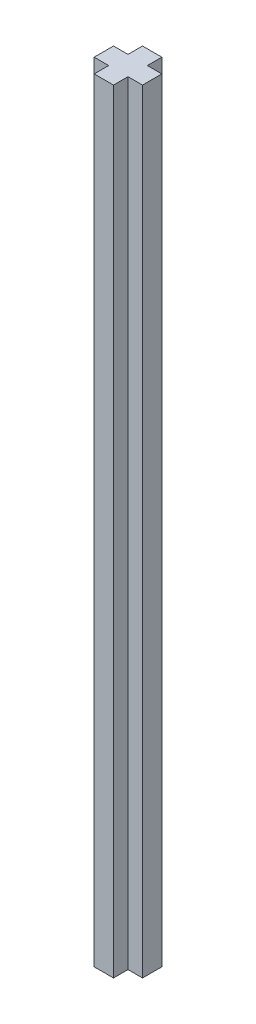
ISO-10303-21;
HEADER;
FILE_DESCRIPTION(('STEP AP214'),'2;1');
FILE_NAME('part.step','',(''),(''),'','','');
FILE_SCHEMA(('AUTOMOTIVE_DESIGN { 1 0 10303 214 1 1 1 1 }'));
ENDSEC;
DATA;
#1=APPLICATION_CONTEXT('core data for automotive mechanical design processes');
#2=APPLICATION_PROTOCOL_DEFINITION('international standard','automotive_design',2000,#1);
#3=PRODUCT_CONTEXT('',#1,'mechanical');
#4=PRODUCT('Part','Part','',(#3));
#5=PRODUCT_RELATED_PRODUCT_CATEGORY('part','',(#4));
#6=PRODUCT_DEFINITION_FORMATION('','',#4);
#7=PRODUCT_DEFINITION_CONTEXT('part definition',#1,'design');
#8=PRODUCT_DEFINITION('design','',#6,#7);
#9=PRODUCT_DEFINITION_SHAPE('','',#8);
#10=(LENGTH_UNIT() NAMED_UNIT(*) SI_UNIT(.MILLI.,.METRE.));
#11=(NAMED_UNIT(*) PLANE_ANGLE_UNIT() SI_UNIT($,.RADIAN.));
#12=(NAMED_UNIT(*) SI_UNIT($,.STERADIAN.) SOLID_ANGLE_UNIT());
#13=UNCERTAINTY_MEASURE_WITH_UNIT(LENGTH_MEASURE(1.E-05),#10,'distance_accuracy_value','');
#14=(GEOMETRIC_REPRESENTATION_CONTEXT(3) GLOBAL_UNCERTAINTY_ASSIGNED_CONTEXT((#13)) GLOBAL_UNIT_ASSIGNED_CONTEXT((#10,
#11,#12)) REPRESENTATION_CONTEXT('',''));
#15=CARTESIAN_POINT('',(0.,0.,0.));
#16=DIRECTION('',(0.,0.,1.));
#17=DIRECTION('',(1.,0.,0.));
#18=AXIS2_PLACEMENT_3D('',#15,#16,#17);
#19=CARTESIAN_POINT('',(1.,80.,0.999999999999999));
#20=DIRECTION('',(-1.,0.,0.));
#21=DIRECTION('',(0.,0.,1.));
#22=AXIS2_PLACEMENT_3D('',#19,#20,#21);
#23=PLANE('',#22);
#24=DIRECTION('',(0.,0.,-1.));
#25=VECTOR('',#24,1.);
#26=CARTESIAN_POINT('',(1.,0.,0.999999999999999));
#27=LINE('',#26,#25);
#28=CARTESIAN_POINT('',(1.,0.,2.5));
#29=VERTEX_POINT('',#28);
#30=CARTESIAN_POINT('',(1.,0.,0.999999999999999));
#31=VERTEX_POINT('',#30);
#32=EDGE_CURVE('E163',#29,#31,#27,.T.);
#33=ORIENTED_EDGE('',*,*,#32,.T.);
#34=DIRECTION('',(0.,-1.,0.));
#35=VECTOR('',#34,1.);
#36=CARTESIAN_POINT('',(1.,80.,0.999999999999999));
#37=LINE('',#36,#35);
#38=CARTESIAN_POINT('',(1.,80.,0.999999999999999));
#39=VERTEX_POINT('',#38);
#40=EDGE_CURVE('E11',#39,#31,#37,.T.);
#41=ORIENTED_EDGE('',*,*,#40,.F.);
#42=DIRECTION('',(0.,0.,-1.));
#43=VECTOR('',#42,1.);
#44=CARTESIAN_POINT('',(1.,80.,0.999999999999999));
#45=LINE('',#44,#43);
#46=CARTESIAN_POINT('',(1.,80.,2.5));
#47=VERTEX_POINT('',#46);
#48=EDGE_CURVE('E197',#47,#39,#45,.T.);
#49=ORIENTED_EDGE('',*,*,#48,.F.);
#50=DIRECTION('',(0.,-1.,0.));
#51=VECTOR('',#50,1.);
#52=CARTESIAN_POINT('',(1.,80.,2.5));
#53=LINE('',#52,#51);
#54=EDGE_CURVE('E159',#47,#29,#53,.T.);
#55=ORIENTED_EDGE('',*,*,#54,.T.);
#56=EDGE_LOOP('',(#33,#41,#49,#55));
#57=FACE_BOUND('',#56,.T.);
#58=ADVANCED_FACE('F38',(#57),#23,.F.);
#59=CARTESIAN_POINT('',(1.,80.,0.999999999999999));
#60=DIRECTION('',(0.,0.,-1.));
#61=DIRECTION('',(-1.,0.,0.));
#62=AXIS2_PLACEMENT_3D('',#59,#60,#61);
#63=PLANE('',#62);
#64=DIRECTION('',(1.,0.,0.));
#65=VECTOR('',#64,1.);
#66=CARTESIAN_POINT('',(1.,0.,0.999999999999999));
#67=LINE('',#66,#65);
#68=CARTESIAN_POINT('',(2.5,0.,0.999999999999999));
#69=VERTEX_POINT('',#68);
#70=EDGE_CURVE('E167',#31,#69,#67,.T.);
#71=ORIENTED_EDGE('',*,*,#70,.T.);
#72=DIRECTION('',(0.,-1.,0.));
#73=VECTOR('',#72,1.);
#74=CARTESIAN_POINT('',(2.5,80.,0.999999999999999));
#75=LINE('',#74,#73);
#76=CARTESIAN_POINT('',(2.5,80.,0.999999999999999));
#77=VERTEX_POINT('',#76);
#78=EDGE_CURVE('E47',#77,#69,#75,.T.);
#79=ORIENTED_EDGE('',*,*,#78,.F.);
#80=DIRECTION('',(1.,0.,0.));
#81=VECTOR('',#80,1.);
#82=CARTESIAN_POINT('',(1.,80.,0.999999999999999));
#83=LINE('',#82,#81);
#84=EDGE_CURVE('E110',#39,#77,#83,.T.);
#85=ORIENTED_EDGE('',*,*,#84,.F.);
#86=ORIENTED_EDGE('',*,*,#40,.T.);
#87=EDGE_LOOP('',(#71,#79,#85,#86));
#88=FACE_BOUND('',#87,.T.);
#89=ADVANCED_FACE('F291',(#88),#63,.F.);
#90=CARTESIAN_POINT('',(2.5,80.,-1.));
#91=DIRECTION('',(-1.,0.,0.));
#92=DIRECTION('',(0.,0.,1.));
#93=AXIS2_PLACEMENT_3D('',#90,#91,#92);
#94=PLANE('',#93);
#95=DIRECTION('',(0.,0.,-1.));
#96=VECTOR('',#95,1.);
#97=CARTESIAN_POINT('',(2.5,0.,-1.));
#98=LINE('',#97,#96);
#99=CARTESIAN_POINT('',(2.5,0.,-1.));
#100=VERTEX_POINT('',#99);
#101=EDGE_CURVE('E170',#69,#100,#98,.T.);
#102=ORIENTED_EDGE('',*,*,#101,.T.);
#103=DIRECTION('',(0.,-1.,0.));
#104=VECTOR('',#103,1.);
#105=CARTESIAN_POINT('',(2.5,80.,-1.));
#106=LINE('',#105,#104);
#107=CARTESIAN_POINT('',(2.5,80.,-1.));
#108=VERTEX_POINT('',#107);
#109=EDGE_CURVE('E224',#108,#100,#106,.T.);
#110=ORIENTED_EDGE('',*,*,#109,.F.);
#111=DIRECTION('',(0.,0.,-1.));
#112=VECTOR('',#111,1.);
#113=CARTESIAN_POINT('',(2.5,80.,-1.));
#114=LINE('',#113,#112);
#115=EDGE_CURVE('E234',#77,#108,#114,.T.);
#116=ORIENTED_EDGE('',*,*,#115,.F.);
#117=ORIENTED_EDGE('',*,*,#78,.T.);
#118=EDGE_LOOP('',(#102,#110,#116,#117));
#119=FACE_BOUND('',#118,.T.);
#120=ADVANCED_FACE('F232',(#119),#94,.F.);
#121=CARTESIAN_POINT('',(1.,80.,-1.));
#122=DIRECTION('',(0.,0.,1.));
#123=DIRECTION('',(1.,0.,0.));
#124=AXIS2_PLACEMENT_3D('',#121,#122,#123);
#125=PLANE('',#124);
#126=DIRECTION('',(-1.,0.,0.));
#127=VECTOR('',#126,1.);
#128=CARTESIAN_POINT('',(1.,0.,-1.));
#129=LINE('',#128,#127);
#130=CARTESIAN_POINT('',(1.,0.,-1.));
#131=VERTEX_POINT('',#130);
#132=EDGE_CURVE('E173',#100,#131,#129,.T.);
#133=ORIENTED_EDGE('',*,*,#132,.T.);
#134=DIRECTION('',(0.,-1.,0.));
#135=VECTOR('',#134,1.);
#136=CARTESIAN_POINT('',(1.,80.,-1.));
#137=LINE('',#136,#135);
#138=CARTESIAN_POINT('',(1.,80.,-1.));
#139=VERTEX_POINT('',#138);
#140=EDGE_CURVE('E220',#139,#131,#137,.T.);
#141=ORIENTED_EDGE('',*,*,#140,.F.);
#142=DIRECTION('',(-1.,0.,0.));
#143=VECTOR('',#142,1.);
#144=CARTESIAN_POINT('',(1.,80.,-1.));
#145=LINE('',#144,#143);
#146=EDGE_CURVE('E253',#108,#139,#145,.T.);
#147=ORIENTED_EDGE('',*,*,#146,.F.);
#148=ORIENTED_EDGE('',*,*,#109,.T.);
#149=EDGE_LOOP('',(#133,#141,#147,#148));
#150=FACE_BOUND('',#149,.T.);
#151=ADVANCED_FACE('F243',(#150),#125,.F.);
#152=CARTESIAN_POINT('',(1.,80.,-2.5));
#153=DIRECTION('',(-1.,0.,0.));
#154=DIRECTION('',(0.,0.,1.));
#155=AXIS2_PLACEMENT_3D('',#152,#153,#154);
#156=PLANE('',#155);
#157=DIRECTION('',(0.,0.,-1.));
#158=VECTOR('',#157,1.);
#159=CARTESIAN_POINT('',(1.,0.,-2.5));
#160=LINE('',#159,#158);
#161=CARTESIAN_POINT('',(1.,0.,-2.5));
#162=VERTEX_POINT('',#161);
#163=EDGE_CURVE('E176',#131,#162,#160,.T.);
#164=ORIENTED_EDGE('',*,*,#163,.T.);
#165=DIRECTION('',(0.,-1.,0.));
#166=VECTOR('',#165,1.);
#167=CARTESIAN_POINT('',(1.,80.,-2.5));
#168=LINE('',#167,#166);
#169=CARTESIAN_POINT('',(1.,80.,-2.5));
#170=VERTEX_POINT('',#169);
#171=EDGE_CURVE('E216',#170,#162,#168,.T.);
#172=ORIENTED_EDGE('',*,*,#171,.F.);
#173=DIRECTION('',(0.,0.,-1.));
#174=VECTOR('',#173,1.);
#175=CARTESIAN_POINT('',(1.,80.,-2.5));
#176=LINE('',#175,#174);
#177=EDGE_CURVE('E249',#139,#170,#176,.T.);
#178=ORIENTED_EDGE('',*,*,#177,.F.);
#179=ORIENTED_EDGE('',*,*,#140,.T.);
#180=EDGE_LOOP('',(#164,#172,#178,#179));
#181=FACE_BOUND('',#180,.T.);
#182=ADVANCED_FACE('F247',(#181),#156,.F.);
#183=CARTESIAN_POINT('',(-1.,80.,-2.5));
#184=DIRECTION('',(0.,0.,1.));
#185=DIRECTION('',(1.,0.,0.));
#186=AXIS2_PLACEMENT_3D('',#183,#184,#185);
#187=PLANE('',#186);
#188=DIRECTION('',(-1.,0.,0.));
#189=VECTOR('',#188,1.);
#190=CARTESIAN_POINT('',(-1.,0.,-2.5));
#191=LINE('',#190,#189);
#192=CARTESIAN_POINT('',(-1.,0.,-2.5));
#193=VERTEX_POINT('',#192);
#194=EDGE_CURVE('E179',#162,#193,#191,.T.);
#195=ORIENTED_EDGE('',*,*,#194,.T.);
#196=DIRECTION('',(0.,-1.,0.));
#197=VECTOR('',#196,1.);
#198=CARTESIAN_POINT('',(-1.,80.,-2.5));
#199=LINE('',#198,#197);
#200=CARTESIAN_POINT('',(-1.,80.,-2.5));
#201=VERTEX_POINT('',#200);
#202=EDGE_CURVE('E212',#201,#193,#199,.T.);
#203=ORIENTED_EDGE('',*,*,#202,.F.);
#204=DIRECTION('',(-1.,0.,0.));
#205=VECTOR('',#204,1.);
#206=CARTESIAN_POINT('',(-1.,80.,-2.5));
#207=LINE('',#206,#205);
#208=EDGE_CURVE('E252',#170,#201,#207,.T.);
#209=ORIENTED_EDGE('',*,*,#208,.F.);
#210=ORIENTED_EDGE('',*,*,#171,.T.);
#211=EDGE_LOOP('',(#195,#203,#209,#210));
#212=FACE_BOUND('',#211,.T.);
#213=ADVANCED_FACE('F304',(#212),#187,.F.);
#214=CARTESIAN_POINT('',(-1.,80.,-2.5));
#215=DIRECTION('',(1.,0.,0.));
#216=DIRECTION('',(0.,0.,-1.));
#217=AXIS2_PLACEMENT_3D('',#214,#215,#216);
#218=PLANE('',#217);
#219=DIRECTION('',(0.,0.,1.));
#220=VECTOR('',#219,1.);
#221=CARTESIAN_POINT('',(-1.,0.,-2.5));
#222=LINE('',#221,#220);
#223=CARTESIAN_POINT('',(-1.,0.,-1.));
#224=VERTEX_POINT('',#223);
#225=EDGE_CURVE('E182',#193,#224,#222,.T.);
#226=ORIENTED_EDGE('',*,*,#225,.T.);
#227=DIRECTION('',(0.,-1.,0.));
#228=VECTOR('',#227,1.);
#229=CARTESIAN_POINT('',(-1.,80.,-1.));
#230=LINE('',#229,#228);
#231=CARTESIAN_POINT('',(-1.,80.,-1.));
#232=VERTEX_POINT('',#231);
#233=EDGE_CURVE('E208',#232,#224,#230,.T.);
#234=ORIENTED_EDGE('',*,*,#233,.F.);
#235=DIRECTION('',(0.,0.,1.));
#236=VECTOR('',#235,1.);
#237=CARTESIAN_POINT('',(-1.,80.,-2.5));
#238=LINE('',#237,#236);
#239=EDGE_CURVE('E257',#201,#232,#238,.T.);
#240=ORIENTED_EDGE('',*,*,#239,.F.);
#241=ORIENTED_EDGE('',*,*,#202,.T.);
#242=EDGE_LOOP('',(#226,#234,#240,#241));
#243=FACE_BOUND('',#242,.T.);
#244=ADVANCED_FACE('F307',(#243),#218,.F.);
#245=CARTESIAN_POINT('',(-2.5,80.,-1.));
#246=DIRECTION('',(0.,0.,1.));
#247=DIRECTION('',(1.,0.,0.));
#248=AXIS2_PLACEMENT_3D('',#245,#246,#247);
#249=PLANE('',#248);
#250=DIRECTION('',(-1.,0.,0.));
#251=VECTOR('',#250,1.);
#252=CARTESIAN_POINT('',(-2.5,0.,-1.));
#253=LINE('',#252,#251);
#254=CARTESIAN_POINT('',(-2.5,0.,-1.));
#255=VERTEX_POINT('',#254);
#256=EDGE_CURVE('E185',#224,#255,#253,.T.);
#257=ORIENTED_EDGE('',*,*,#256,.T.);
#258=DIRECTION('',(0.,-1.,0.));
#259=VECTOR('',#258,1.);
#260=CARTESIAN_POINT('',(-2.5,80.,-1.));
#261=LINE('',#260,#259);
#262=CARTESIAN_POINT('',(-2.5,80.,-1.));
#263=VERTEX_POINT('',#262);
#264=EDGE_CURVE('E204',#263,#255,#261,.T.);
#265=ORIENTED_EDGE('',*,*,#264,.F.);
#266=DIRECTION('',(-1.,0.,0.));
#267=VECTOR('',#266,1.);
#268=CARTESIAN_POINT('',(-2.5,80.,-1.));
#269=LINE('',#268,#267);
#270=EDGE_CURVE('E264',#232,#263,#269,.T.);
#271=ORIENTED_EDGE('',*,*,#270,.F.);
#272=ORIENTED_EDGE('',*,*,#233,.T.);
#273=EDGE_LOOP('',(#257,#265,#271,#272));
#274=FACE_BOUND('',#273,.T.);
#275=ADVANCED_FACE('F272',(#274),#249,.F.);
#276=CARTESIAN_POINT('',(-2.5,80.,-1.));
#277=DIRECTION('',(1.,0.,0.));
#278=DIRECTION('',(0.,0.,-1.));
#279=AXIS2_PLACEMENT_3D('',#276,#277,#278);
#280=PLANE('',#279);
#281=DIRECTION('',(0.,0.,1.));
#282=VECTOR('',#281,1.);
#283=CARTESIAN_POINT('',(-2.5,0.,-1.));
#284=LINE('',#283,#282);
#285=CARTESIAN_POINT('',(-2.5,0.,0.999999999999999));
#286=VERTEX_POINT('',#285);
#287=EDGE_CURVE('E188',#255,#286,#284,.T.);
#288=ORIENTED_EDGE('',*,*,#287,.T.);
#289=DIRECTION('',(0.,-1.,0.));
#290=VECTOR('',#289,1.);
#291=CARTESIAN_POINT('',(-2.5,80.,0.999999999999999));
#292=LINE('',#291,#290);
#293=CARTESIAN_POINT('',(-2.5,80.,0.999999999999999));
#294=VERTEX_POINT('',#293);
#295=EDGE_CURVE('E152',#294,#286,#292,.T.);
#296=ORIENTED_EDGE('',*,*,#295,.F.);
#297=DIRECTION('',(0.,0.,1.));
#298=VECTOR('',#297,1.);
#299=CARTESIAN_POINT('',(-2.5,80.,-1.));
#300=LINE('',#299,#298);
#301=EDGE_CURVE('E141',#263,#294,#300,.T.);
#302=ORIENTED_EDGE('',*,*,#301,.F.);
#303=ORIENTED_EDGE('',*,*,#264,.T.);
#304=EDGE_LOOP('',(#288,#296,#302,#303));
#305=FACE_BOUND('',#304,.T.);
#306=ADVANCED_FACE('F276',(#305),#280,.F.);
#307=CARTESIAN_POINT('',(-2.5,80.,0.999999999999999));
#308=DIRECTION('',(0.,0.,-1.));
#309=DIRECTION('',(-1.,0.,0.));
#310=AXIS2_PLACEMENT_3D('',#307,#308,#309);
#311=PLANE('',#310);
#312=DIRECTION('',(1.,0.,0.));
#313=VECTOR('',#312,1.);
#314=CARTESIAN_POINT('',(-2.5,0.,0.999999999999999));
#315=LINE('',#314,#313);
#316=CARTESIAN_POINT('',(-1.,0.,0.999999999999999));
#317=VERTEX_POINT('',#316);
#318=EDGE_CURVE('E150',#286,#317,#315,.T.);
#319=ORIENTED_EDGE('',*,*,#318,.T.);
#320=DIRECTION('',(0.,-1.,0.));
#321=VECTOR('',#320,1.);
#322=CARTESIAN_POINT('',(-1.,80.,0.999999999999999));
#323=LINE('',#322,#321);
#324=CARTESIAN_POINT('',(-1.,80.,0.999999999999999));
#325=VERTEX_POINT('',#324);
#326=EDGE_CURVE('E147',#325,#317,#323,.T.);
#327=ORIENTED_EDGE('',*,*,#326,.F.);
#328=DIRECTION('',(1.,0.,0.));
#329=VECTOR('',#328,1.);
#330=CARTESIAN_POINT('',(-2.5,80.,0.999999999999999));
#331=LINE('',#330,#329);
#332=EDGE_CURVE('E135',#294,#325,#331,.T.);
#333=ORIENTED_EDGE('',*,*,#332,.F.);
#334=ORIENTED_EDGE('',*,*,#295,.T.);
#335=EDGE_LOOP('',(#319,#327,#333,#334));
#336=FACE_BOUND('',#335,.T.);
#337=ADVANCED_FACE('F148',(#336),#311,.F.);
#338=CARTESIAN_POINT('',(-1.,80.,0.999999999999999));
#339=DIRECTION('',(1.,0.,0.));
#340=DIRECTION('',(0.,0.,-1.));
#341=AXIS2_PLACEMENT_3D('',#338,#339,#340);
#342=PLANE('',#341);
#343=DIRECTION('',(0.,0.,1.));
#344=VECTOR('',#343,1.);
#345=CARTESIAN_POINT('',(-1.,0.,0.999999999999999));
#346=LINE('',#345,#344);
#347=CARTESIAN_POINT('',(-1.,0.,2.5));
#348=VERTEX_POINT('',#347);
#349=EDGE_CURVE('E96',#317,#348,#346,.T.);
#350=ORIENTED_EDGE('',*,*,#349,.T.);
#351=DIRECTION('',(0.,-1.,0.));
#352=VECTOR('',#351,1.);
#353=CARTESIAN_POINT('',(-1.,80.,2.5));
#354=LINE('',#353,#352);
#355=CARTESIAN_POINT('',(-1.,80.,2.5));
#356=VERTEX_POINT('',#355);
#357=EDGE_CURVE('E153',#356,#348,#354,.T.);
#358=ORIENTED_EDGE('',*,*,#357,.F.);
#359=DIRECTION('',(0.,0.,1.));
#360=VECTOR('',#359,1.);
#361=CARTESIAN_POINT('',(-1.,80.,0.999999999999999));
#362=LINE('',#361,#360);
#363=EDGE_CURVE('E139',#325,#356,#362,.T.);
#364=ORIENTED_EDGE('',*,*,#363,.F.);
#365=ORIENTED_EDGE('',*,*,#326,.T.);
#366=EDGE_LOOP('',(#350,#358,#364,#365));
#367=FACE_BOUND('',#366,.T.);
#368=ADVANCED_FACE('F155',(#367),#342,.F.);
#369=CARTESIAN_POINT('',(-1.,80.,2.5));
#370=DIRECTION('',(0.,0.,-1.));
#371=DIRECTION('',(-1.,0.,0.));
#372=AXIS2_PLACEMENT_3D('',#369,#370,#371);
#373=PLANE('',#372);
#374=DIRECTION('',(1.,0.,0.));
#375=VECTOR('',#374,1.);
#376=CARTESIAN_POINT('',(-1.,0.,2.5));
#377=LINE('',#376,#375);
#378=EDGE_CURVE('E102',#348,#29,#377,.T.);
#379=ORIENTED_EDGE('',*,*,#378,.T.);
#380=ORIENTED_EDGE('',*,*,#54,.F.);
#381=DIRECTION('',(1.,0.,0.));
#382=VECTOR('',#381,1.);
#383=CARTESIAN_POINT('',(-1.,80.,2.5));
#384=LINE('',#383,#382);
#385=EDGE_CURVE('E55',#356,#47,#384,.T.);
#386=ORIENTED_EDGE('',*,*,#385,.F.);
#387=ORIENTED_EDGE('',*,*,#357,.T.);
#388=EDGE_LOOP('',(#379,#380,#386,#387));
#389=FACE_BOUND('',#388,.T.);
#390=ADVANCED_FACE('F280',(#389),#373,.F.);
#391=CARTESIAN_POINT('',(0.,80.,0.));
#392=DIRECTION('',(0.,1.,0.));
#393=DIRECTION('',(0.,0.,1.));
#394=AXIS2_PLACEMENT_3D('',#391,#392,#393);
#395=PLANE('',#394);
#396=ORIENTED_EDGE('',*,*,#48,.T.);
#397=ORIENTED_EDGE('',*,*,#84,.T.);
#398=ORIENTED_EDGE('',*,*,#115,.T.);
#399=ORIENTED_EDGE('',*,*,#146,.T.);
#400=ORIENTED_EDGE('',*,*,#177,.T.);
#401=ORIENTED_EDGE('',*,*,#208,.T.);
#402=ORIENTED_EDGE('',*,*,#239,.T.);
#403=ORIENTED_EDGE('',*,*,#270,.T.);
#404=ORIENTED_EDGE('',*,*,#301,.T.);
#405=ORIENTED_EDGE('',*,*,#332,.T.);
#406=ORIENTED_EDGE('',*,*,#363,.T.);
#407=ORIENTED_EDGE('',*,*,#385,.T.);
#408=EDGE_LOOP('',(#396,#397,#398,#399,#400,#401,#402,#403,#404,#405,#406,#407));
#409=FACE_BOUND('',#408,.T.);
#410=ADVANCED_FACE('F137',(#409),#395,.T.);
#411=CARTESIAN_POINT('',(0.,0.,0.));
#412=DIRECTION('',(0.,1.,0.));
#413=DIRECTION('',(0.,0.,1.));
#414=AXIS2_PLACEMENT_3D('',#411,#412,#413);
#415=PLANE('',#414);
#416=ORIENTED_EDGE('',*,*,#32,.F.);
#417=ORIENTED_EDGE('',*,*,#378,.F.);
#418=ORIENTED_EDGE('',*,*,#349,.F.);
#419=ORIENTED_EDGE('',*,*,#318,.F.);
#420=ORIENTED_EDGE('',*,*,#287,.F.);
#421=ORIENTED_EDGE('',*,*,#256,.F.);
#422=ORIENTED_EDGE('',*,*,#225,.F.);
#423=ORIENTED_EDGE('',*,*,#194,.F.);
#424=ORIENTED_EDGE('',*,*,#163,.F.);
#425=ORIENTED_EDGE('',*,*,#132,.F.);
#426=ORIENTED_EDGE('',*,*,#101,.F.);
#427=ORIENTED_EDGE('',*,*,#70,.F.);
#428=EDGE_LOOP('',(#416,#417,#418,#419,#420,#421,#422,#423,#424,#425,#426,#427));
#429=FACE_BOUND('',#428,.T.);
#430=ADVANCED_FACE('F238',(#429),#415,.F.);
#431=CLOSED_SHELL('',(#58,#89,#120,#151,#182,#213,#244,#275,#306,#337,#368,#390,#410,#430));
#432=MANIFOLD_SOLID_BREP('B2',#431);
#433=ADVANCED_BREP_SHAPE_REPRESENTATION('',(#18,#432),#14);
#434=SHAPE_DEFINITION_REPRESENTATION(#9,#433);
ENDSEC;
END-ISO-10303-21;
